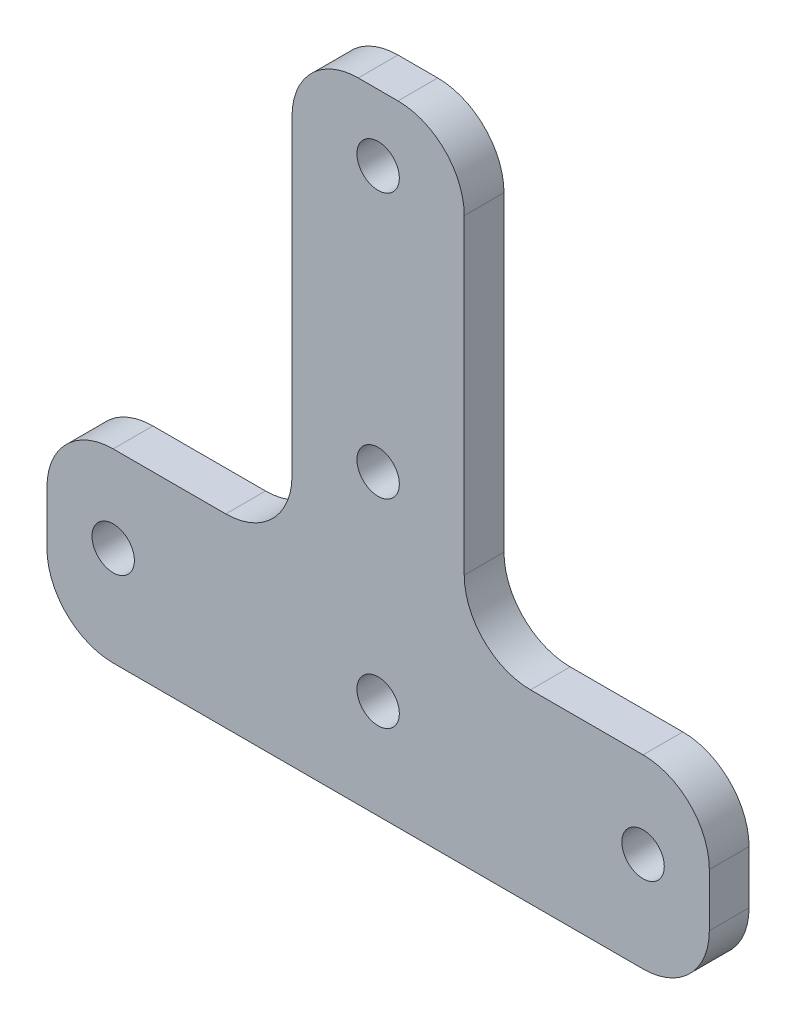
ISO-10303-21;
HEADER;
FILE_DESCRIPTION(('STEP AP214'),'2;1');
FILE_NAME('part.step','',(''),(''),'','','');
FILE_SCHEMA(('AUTOMOTIVE_DESIGN { 1 0 10303 214 1 1 1 1 }'));
ENDSEC;
DATA;
#1=APPLICATION_CONTEXT('core data for automotive mechanical design processes');
#2=APPLICATION_PROTOCOL_DEFINITION('international standard','automotive_design',2000,#1);
#3=PRODUCT_CONTEXT('',#1,'mechanical');
#4=PRODUCT('Part','Part','',(#3));
#5=PRODUCT_RELATED_PRODUCT_CATEGORY('part','',(#4));
#6=PRODUCT_DEFINITION_FORMATION('','',#4);
#7=PRODUCT_DEFINITION_CONTEXT('part definition',#1,'design');
#8=PRODUCT_DEFINITION('design','',#6,#7);
#9=PRODUCT_DEFINITION_SHAPE('','',#8);
#10=(LENGTH_UNIT() NAMED_UNIT(*) SI_UNIT(.MILLI.,.METRE.));
#11=(NAMED_UNIT(*) PLANE_ANGLE_UNIT() SI_UNIT($,.RADIAN.));
#12=(NAMED_UNIT(*) SI_UNIT($,.STERADIAN.) SOLID_ANGLE_UNIT());
#13=UNCERTAINTY_MEASURE_WITH_UNIT(LENGTH_MEASURE(1.E-05),#10,'distance_accuracy_value','');
#14=(GEOMETRIC_REPRESENTATION_CONTEXT(3) GLOBAL_UNCERTAINTY_ASSIGNED_CONTEXT((#13)) GLOBAL_UNIT_ASSIGNED_CONTEXT((#10,
#11,#12)) REPRESENTATION_CONTEXT('',''));
#15=CARTESIAN_POINT('',(0.,0.,0.));
#16=DIRECTION('',(0.,0.,1.));
#17=DIRECTION('',(1.,0.,0.));
#18=AXIS2_PLACEMENT_3D('',#15,#16,#17);
#19=CARTESIAN_POINT('',(0.,0.,3.));
#20=DIRECTION('',(0.,0.,-1.));
#21=DIRECTION('',(-1.,0.,0.));
#22=AXIS2_PLACEMENT_3D('',#19,#20,#21);
#23=PLANE('',#22);
#24=DIRECTION('',(-1.,0.,0.));
#25=VECTOR('',#24,1.);
#26=CARTESIAN_POINT('',(6.5,40.,3.));
#27=LINE('',#26,#25);
#28=CARTESIAN_POINT('',(1.5,40.,3.));
#29=VERTEX_POINT('',#28);
#30=CARTESIAN_POINT('',(-1.5,40.,3.));
#31=VERTEX_POINT('',#30);
#32=EDGE_CURVE('E202',#29,#31,#27,.T.);
#33=ORIENTED_EDGE('',*,*,#32,.T.);
#34=CARTESIAN_POINT('',(-1.5,35.,3.));
#35=DIRECTION('',(0.,0.,-1.));
#36=DIRECTION('',(-1.,0.,0.));
#37=AXIS2_PLACEMENT_3D('',#34,#35,#36);
#38=CIRCLE('',#37,5.);
#39=CARTESIAN_POINT('',(-6.5,35.,3.));
#40=VERTEX_POINT('',#39);
#41=EDGE_CURVE('E261',#31,#40,#38,.F.);
#42=ORIENTED_EDGE('',*,*,#41,.T.);
#43=DIRECTION('',(0.,-1.,0.));
#44=VECTOR('',#43,1.);
#45=CARTESIAN_POINT('',(-6.5,40.,3.));
#46=LINE('',#45,#44);
#47=CARTESIAN_POINT('',(-6.5,11.5,3.));
#48=VERTEX_POINT('',#47);
#49=EDGE_CURVE('E180',#40,#48,#46,.T.);
#50=ORIENTED_EDGE('',*,*,#49,.T.);
#51=CARTESIAN_POINT('',(-11.5,11.5,3.));
#52=DIRECTION('',(0.,0.,-1.));
#53=DIRECTION('',(-1.,0.,0.));
#54=AXIS2_PLACEMENT_3D('',#51,#52,#53);
#55=CIRCLE('',#54,5.);
#56=CARTESIAN_POINT('',(-11.5,6.5,3.));
#57=VERTEX_POINT('',#56);
#58=EDGE_CURVE('E307',#48,#57,#55,.T.);
#59=ORIENTED_EDGE('',*,*,#58,.T.);
#60=DIRECTION('',(-1.,0.,0.));
#61=VECTOR('',#60,1.);
#62=CARTESIAN_POINT('',(-6.5,6.5,3.));
#63=LINE('',#62,#61);
#64=CARTESIAN_POINT('',(-20.,6.49999999999999,3.));
#65=VERTEX_POINT('',#64);
#66=EDGE_CURVE('E341',#57,#65,#63,.T.);
#67=ORIENTED_EDGE('',*,*,#66,.T.);
#68=CARTESIAN_POINT('',(-20.,1.49999999999999,3.));
#69=DIRECTION('',(0.,0.,-1.));
#70=DIRECTION('',(-1.,0.,0.));
#71=AXIS2_PLACEMENT_3D('',#68,#69,#70);
#72=CIRCLE('',#71,5.);
#73=CARTESIAN_POINT('',(-25.,1.5,3.));
#74=VERTEX_POINT('',#73);
#75=EDGE_CURVE('E246',#65,#74,#72,.F.);
#76=ORIENTED_EDGE('',*,*,#75,.T.);
#77=DIRECTION('',(0.,-1.,0.));
#78=VECTOR('',#77,1.);
#79=CARTESIAN_POINT('',(-25.,6.49999999999999,3.));
#80=LINE('',#79,#78);
#81=CARTESIAN_POINT('',(-25.,-2.5,3.));
#82=VERTEX_POINT('',#81);
#83=EDGE_CURVE('E337',#74,#82,#80,.T.);
#84=ORIENTED_EDGE('',*,*,#83,.T.);
#85=CARTESIAN_POINT('',(-20.,-2.5,3.));
#86=DIRECTION('',(0.,0.,-1.));
#87=DIRECTION('',(-1.,0.,0.));
#88=AXIS2_PLACEMENT_3D('',#85,#86,#87);
#89=CIRCLE('',#88,5.);
#90=CARTESIAN_POINT('',(-20.,-7.50000000000001,3.));
#91=VERTEX_POINT('',#90);
#92=EDGE_CURVE('E249',#82,#91,#89,.F.);
#93=ORIENTED_EDGE('',*,*,#92,.T.);
#94=DIRECTION('',(1.,0.,0.));
#95=VECTOR('',#94,1.);
#96=CARTESIAN_POINT('',(-25.,-7.50000000000001,3.));
#97=LINE('',#96,#95);
#98=CARTESIAN_POINT('',(20.,-7.50000000000001,3.));
#99=VERTEX_POINT('',#98);
#100=EDGE_CURVE('E333',#91,#99,#97,.T.);
#101=ORIENTED_EDGE('',*,*,#100,.T.);
#102=CARTESIAN_POINT('',(20.,-2.5,3.));
#103=DIRECTION('',(0.,0.,-1.));
#104=DIRECTION('',(-1.,0.,0.));
#105=AXIS2_PLACEMENT_3D('',#102,#103,#104);
#106=CIRCLE('',#105,5.);
#107=CARTESIAN_POINT('',(25.,-2.5,3.));
#108=VERTEX_POINT('',#107);
#109=EDGE_CURVE('E252',#99,#108,#106,.F.);
#110=ORIENTED_EDGE('',*,*,#109,.T.);
#111=DIRECTION('',(0.,1.,0.));
#112=VECTOR('',#111,1.);
#113=CARTESIAN_POINT('',(25.,-7.50000000000001,3.));
#114=LINE('',#113,#112);
#115=CARTESIAN_POINT('',(25.,1.5,3.));
#116=VERTEX_POINT('',#115);
#117=EDGE_CURVE('E327',#108,#116,#114,.T.);
#118=ORIENTED_EDGE('',*,*,#117,.T.);
#119=CARTESIAN_POINT('',(20.,1.5,3.));
#120=DIRECTION('',(0.,0.,-1.));
#121=DIRECTION('',(-1.,0.,0.));
#122=AXIS2_PLACEMENT_3D('',#119,#120,#121);
#123=CIRCLE('',#122,5.);
#124=CARTESIAN_POINT('',(20.,6.5,3.));
#125=VERTEX_POINT('',#124);
#126=EDGE_CURVE('E255',#116,#125,#123,.F.);
#127=ORIENTED_EDGE('',*,*,#126,.T.);
#128=DIRECTION('',(-1.,0.,0.));
#129=VECTOR('',#128,1.);
#130=CARTESIAN_POINT('',(25.,6.5,3.));
#131=LINE('',#130,#129);
#132=CARTESIAN_POINT('',(11.5,6.5,3.));
#133=VERTEX_POINT('',#132);
#134=EDGE_CURVE('E323',#125,#133,#131,.T.);
#135=ORIENTED_EDGE('',*,*,#134,.T.);
#136=CARTESIAN_POINT('',(11.5,11.5,3.));
#137=DIRECTION('',(0.,0.,-1.));
#138=DIRECTION('',(-1.,0.,0.));
#139=AXIS2_PLACEMENT_3D('',#136,#137,#138);
#140=CIRCLE('',#139,5.);
#141=CARTESIAN_POINT('',(6.5,11.5,3.));
#142=VERTEX_POINT('',#141);
#143=EDGE_CURVE('E11',#133,#142,#140,.T.);
#144=ORIENTED_EDGE('',*,*,#143,.T.);
#145=DIRECTION('',(0.,1.,0.));
#146=VECTOR('',#145,1.);
#147=CARTESIAN_POINT('',(6.5,6.5,3.));
#148=LINE('',#147,#146);
#149=CARTESIAN_POINT('',(6.5,35.,3.));
#150=VERTEX_POINT('',#149);
#151=EDGE_CURVE('E320',#142,#150,#148,.T.);
#152=ORIENTED_EDGE('',*,*,#151,.T.);
#153=CARTESIAN_POINT('',(1.5,35.,3.));
#154=DIRECTION('',(0.,0.,-1.));
#155=DIRECTION('',(-1.,0.,0.));
#156=AXIS2_PLACEMENT_3D('',#153,#154,#155);
#157=CIRCLE('',#156,5.);
#158=EDGE_CURVE('E258',#150,#29,#157,.F.);
#159=ORIENTED_EDGE('',*,*,#158,.T.);
#160=EDGE_LOOP('',(#33,#42,#50,#59,#67,#76,#84,#93,#101,#110,#118,#127,#135,#144,#152,#159));
#161=FACE_BOUND('',#160,.T.);
#162=CARTESIAN_POINT('',(0.,35.,3.));
#163=DIRECTION('',(0.,0.,1.));
#164=DIRECTION('',(1.,0.,0.));
#165=AXIS2_PLACEMENT_3D('',#162,#163,#164);
#166=CIRCLE('',#165,1.6);
#167=CARTESIAN_POINT('',(1.6,35.,3.));
#168=VERTEX_POINT('',#167);
#169=EDGE_CURVE('E191',#168,#168,#166,.T.);
#170=ORIENTED_EDGE('',*,*,#169,.F.);
#171=EDGE_LOOP('',(#170));
#172=FACE_BOUND('',#171,.T.);
#173=CARTESIAN_POINT('',(0.,15.,3.));
#174=DIRECTION('',(0.,0.,1.));
#175=DIRECTION('',(1.,0.,0.));
#176=AXIS2_PLACEMENT_3D('',#173,#174,#175);
#177=CIRCLE('',#176,1.6);
#178=CARTESIAN_POINT('',(1.6,15.,3.));
#179=VERTEX_POINT('',#178);
#180=EDGE_CURVE('E349',#179,#179,#177,.T.);
#181=ORIENTED_EDGE('',*,*,#180,.F.);
#182=EDGE_LOOP('',(#181));
#183=FACE_BOUND('',#182,.T.);
#184=CARTESIAN_POINT('',(0.,0.,3.));
#185=DIRECTION('',(0.,0.,1.));
#186=DIRECTION('',(1.,0.,0.));
#187=AXIS2_PLACEMENT_3D('',#184,#185,#186);
#188=CIRCLE('',#187,1.6);
#189=CARTESIAN_POINT('',(1.6,0.,3.));
#190=VERTEX_POINT('',#189);
#191=EDGE_CURVE('E355',#190,#190,#188,.T.);
#192=ORIENTED_EDGE('',*,*,#191,.F.);
#193=EDGE_LOOP('',(#192));
#194=FACE_BOUND('',#193,.T.);
#195=CARTESIAN_POINT('',(20.,0.,3.));
#196=DIRECTION('',(0.,0.,1.));
#197=DIRECTION('',(1.,0.,0.));
#198=AXIS2_PLACEMENT_3D('',#195,#196,#197);
#199=CIRCLE('',#198,1.6);
#200=CARTESIAN_POINT('',(21.6,0.,3.));
#201=VERTEX_POINT('',#200);
#202=EDGE_CURVE('E363',#201,#201,#199,.T.);
#203=ORIENTED_EDGE('',*,*,#202,.F.);
#204=EDGE_LOOP('',(#203));
#205=FACE_BOUND('',#204,.T.);
#206=CARTESIAN_POINT('',(-20.,0.,3.));
#207=DIRECTION('',(0.,0.,1.));
#208=DIRECTION('',(1.,0.,0.));
#209=AXIS2_PLACEMENT_3D('',#206,#207,#208);
#210=CIRCLE('',#209,1.6);
#211=CARTESIAN_POINT('',(-18.4,0.,3.));
#212=VERTEX_POINT('',#211);
#213=EDGE_CURVE('E371',#212,#212,#210,.T.);
#214=ORIENTED_EDGE('',*,*,#213,.F.);
#215=EDGE_LOOP('',(#214));
#216=FACE_BOUND('',#215,.T.);
#217=ADVANCED_FACE('F45',(#161,#172,#183,#194,#205,#216),#23,.F.);
#218=CARTESIAN_POINT('',(0.,0.,0.));
#219=DIRECTION('',(0.,0.,-1.));
#220=DIRECTION('',(-1.,0.,0.));
#221=AXIS2_PLACEMENT_3D('',#218,#219,#220);
#222=PLANE('',#221);
#223=CARTESIAN_POINT('',(20.,0.,0.));
#224=DIRECTION('',(0.,0.,1.));
#225=DIRECTION('',(1.,0.,0.));
#226=AXIS2_PLACEMENT_3D('',#223,#224,#225);
#227=CIRCLE('',#226,1.6);
#228=CARTESIAN_POINT('',(21.6,0.,0.));
#229=VERTEX_POINT('',#228);
#230=EDGE_CURVE('E367',#229,#229,#227,.T.);
#231=ORIENTED_EDGE('',*,*,#230,.T.);
#232=EDGE_LOOP('',(#231));
#233=FACE_BOUND('',#232,.T.);
#234=CARTESIAN_POINT('',(0.,15.,0.));
#235=DIRECTION('',(0.,0.,1.));
#236=DIRECTION('',(1.,0.,0.));
#237=AXIS2_PLACEMENT_3D('',#234,#235,#236);
#238=CIRCLE('',#237,1.6);
#239=CARTESIAN_POINT('',(1.6,15.,0.));
#240=VERTEX_POINT('',#239);
#241=EDGE_CURVE('E351',#240,#240,#238,.T.);
#242=ORIENTED_EDGE('',*,*,#241,.T.);
#243=EDGE_LOOP('',(#242));
#244=FACE_BOUND('',#243,.T.);
#245=DIRECTION('',(0.,-1.,0.));
#246=VECTOR('',#245,1.);
#247=CARTESIAN_POINT('',(-6.5,40.,0.));
#248=LINE('',#247,#246);
#249=CARTESIAN_POINT('',(-6.5,35.,0.));
#250=VERTEX_POINT('',#249);
#251=CARTESIAN_POINT('',(-6.5,11.5,0.));
#252=VERTEX_POINT('',#251);
#253=EDGE_CURVE('E177',#250,#252,#248,.T.);
#254=ORIENTED_EDGE('',*,*,#253,.F.);
#255=CARTESIAN_POINT('',(-1.5,35.,0.));
#256=DIRECTION('',(0.,0.,-1.));
#257=DIRECTION('',(-1.,0.,0.));
#258=AXIS2_PLACEMENT_3D('',#255,#256,#257);
#259=CIRCLE('',#258,5.);
#260=CARTESIAN_POINT('',(-1.5,40.,0.));
#261=VERTEX_POINT('',#260);
#262=EDGE_CURVE('E159',#250,#261,#259,.T.);
#263=ORIENTED_EDGE('',*,*,#262,.T.);
#264=DIRECTION('',(-1.,0.,0.));
#265=VECTOR('',#264,1.);
#266=CARTESIAN_POINT('',(6.5,40.,0.));
#267=LINE('',#266,#265);
#268=CARTESIAN_POINT('',(1.5,40.,0.));
#269=VERTEX_POINT('',#268);
#270=EDGE_CURVE('E223',#269,#261,#267,.T.);
#271=ORIENTED_EDGE('',*,*,#270,.F.);
#272=CARTESIAN_POINT('',(1.5,35.,0.));
#273=DIRECTION('',(0.,0.,-1.));
#274=DIRECTION('',(-1.,0.,0.));
#275=AXIS2_PLACEMENT_3D('',#272,#273,#274);
#276=CIRCLE('',#275,5.);
#277=CARTESIAN_POINT('',(6.5,35.,0.));
#278=VERTEX_POINT('',#277);
#279=EDGE_CURVE('E171',#269,#278,#276,.T.);
#280=ORIENTED_EDGE('',*,*,#279,.T.);
#281=DIRECTION('',(0.,1.,0.));
#282=VECTOR('',#281,1.);
#283=CARTESIAN_POINT('',(6.5,6.5,0.));
#284=LINE('',#283,#282);
#285=CARTESIAN_POINT('',(6.5,11.5,0.));
#286=VERTEX_POINT('',#285);
#287=EDGE_CURVE('E220',#286,#278,#284,.T.);
#288=ORIENTED_EDGE('',*,*,#287,.F.);
#289=CARTESIAN_POINT('',(11.5,11.5,0.));
#290=DIRECTION('',(0.,0.,-1.));
#291=DIRECTION('',(-1.,0.,0.));
#292=AXIS2_PLACEMENT_3D('',#289,#290,#291);
#293=CIRCLE('',#292,5.);
#294=CARTESIAN_POINT('',(11.5,6.5,0.));
#295=VERTEX_POINT('',#294);
#296=EDGE_CURVE('E54',#286,#295,#293,.F.);
#297=ORIENTED_EDGE('',*,*,#296,.T.);
#298=DIRECTION('',(-1.,0.,0.));
#299=VECTOR('',#298,1.);
#300=CARTESIAN_POINT('',(25.,6.5,0.));
#301=LINE('',#300,#299);
#302=CARTESIAN_POINT('',(20.,6.5,0.));
#303=VERTEX_POINT('',#302);
#304=EDGE_CURVE('E216',#303,#295,#301,.T.);
#305=ORIENTED_EDGE('',*,*,#304,.F.);
#306=CARTESIAN_POINT('',(20.,1.5,0.));
#307=DIRECTION('',(0.,0.,-1.));
#308=DIRECTION('',(-1.,0.,0.));
#309=AXIS2_PLACEMENT_3D('',#306,#307,#308);
#310=CIRCLE('',#309,5.);
#311=CARTESIAN_POINT('',(25.,1.5,0.));
#312=VERTEX_POINT('',#311);
#313=EDGE_CURVE('E236',#303,#312,#310,.T.);
#314=ORIENTED_EDGE('',*,*,#313,.T.);
#315=DIRECTION('',(0.,1.,0.));
#316=VECTOR('',#315,1.);
#317=CARTESIAN_POINT('',(25.,-7.50000000000001,0.));
#318=LINE('',#317,#316);
#319=CARTESIAN_POINT('',(25.,-2.5,0.));
#320=VERTEX_POINT('',#319);
#321=EDGE_CURVE('E212',#320,#312,#318,.T.);
#322=ORIENTED_EDGE('',*,*,#321,.F.);
#323=CARTESIAN_POINT('',(20.,-2.5,0.));
#324=DIRECTION('',(0.,0.,-1.));
#325=DIRECTION('',(-1.,0.,0.));
#326=AXIS2_PLACEMENT_3D('',#323,#324,#325);
#327=CIRCLE('',#326,5.);
#328=CARTESIAN_POINT('',(20.,-7.50000000000001,0.));
#329=VERTEX_POINT('',#328);
#330=EDGE_CURVE('E233',#320,#329,#327,.T.);
#331=ORIENTED_EDGE('',*,*,#330,.T.);
#332=DIRECTION('',(1.,0.,0.));
#333=VECTOR('',#332,1.);
#334=CARTESIAN_POINT('',(-25.,-7.50000000000001,0.));
#335=LINE('',#334,#333);
#336=CARTESIAN_POINT('',(-20.,-7.50000000000001,0.));
#337=VERTEX_POINT('',#336);
#338=EDGE_CURVE('E208',#337,#329,#335,.T.);
#339=ORIENTED_EDGE('',*,*,#338,.F.);
#340=CARTESIAN_POINT('',(-20.,-2.5,0.));
#341=DIRECTION('',(0.,0.,-1.));
#342=DIRECTION('',(-1.,0.,0.));
#343=AXIS2_PLACEMENT_3D('',#340,#341,#342);
#344=CIRCLE('',#343,5.);
#345=CARTESIAN_POINT('',(-25.,-2.5,0.));
#346=VERTEX_POINT('',#345);
#347=EDGE_CURVE('E230',#337,#346,#344,.T.);
#348=ORIENTED_EDGE('',*,*,#347,.T.);
#349=DIRECTION('',(0.,-1.,0.));
#350=VECTOR('',#349,1.);
#351=CARTESIAN_POINT('',(-25.,6.49999999999999,0.));
#352=LINE('',#351,#350);
#353=CARTESIAN_POINT('',(-25.,1.5,0.));
#354=VERTEX_POINT('',#353);
#355=EDGE_CURVE('E196',#354,#346,#352,.T.);
#356=ORIENTED_EDGE('',*,*,#355,.F.);
#357=CARTESIAN_POINT('',(-20.,1.49999999999999,0.));
#358=DIRECTION('',(0.,0.,-1.));
#359=DIRECTION('',(-1.,0.,0.));
#360=AXIS2_PLACEMENT_3D('',#357,#358,#359);
#361=CIRCLE('',#360,5.);
#362=CARTESIAN_POINT('',(-20.,6.49999999999999,0.));
#363=VERTEX_POINT('',#362);
#364=EDGE_CURVE('E182',#354,#363,#361,.T.);
#365=ORIENTED_EDGE('',*,*,#364,.T.);
#366=DIRECTION('',(-1.,0.,0.));
#367=VECTOR('',#366,1.);
#368=CARTESIAN_POINT('',(-6.5,6.5,0.));
#369=LINE('',#368,#367);
#370=CARTESIAN_POINT('',(-11.5,6.5,0.));
#371=VERTEX_POINT('',#370);
#372=EDGE_CURVE('E190',#371,#363,#369,.T.);
#373=ORIENTED_EDGE('',*,*,#372,.F.);
#374=CARTESIAN_POINT('',(-11.5,11.5,0.));
#375=DIRECTION('',(0.,0.,-1.));
#376=DIRECTION('',(-1.,0.,0.));
#377=AXIS2_PLACEMENT_3D('',#374,#375,#376);
#378=CIRCLE('',#377,5.);
#379=EDGE_CURVE('E188',#371,#252,#378,.F.);
#380=ORIENTED_EDGE('',*,*,#379,.T.);
#381=EDGE_LOOP('',(#254,#263,#271,#280,#288,#297,#305,#314,#322,#331,#339,#348,#356,#365,#373,#380));
#382=FACE_BOUND('',#381,.T.);
#383=CARTESIAN_POINT('',(0.,35.,0.));
#384=DIRECTION('',(0.,0.,1.));
#385=DIRECTION('',(1.,0.,0.));
#386=AXIS2_PLACEMENT_3D('',#383,#384,#385);
#387=CIRCLE('',#386,1.6);
#388=CARTESIAN_POINT('',(1.6,35.,0.));
#389=VERTEX_POINT('',#388);
#390=EDGE_CURVE('E199',#389,#389,#387,.T.);
#391=ORIENTED_EDGE('',*,*,#390,.T.);
#392=EDGE_LOOP('',(#391));
#393=FACE_BOUND('',#392,.T.);
#394=CARTESIAN_POINT('',(0.,0.,0.));
#395=DIRECTION('',(0.,0.,1.));
#396=DIRECTION('',(1.,0.,0.));
#397=AXIS2_PLACEMENT_3D('',#394,#395,#396);
#398=CIRCLE('',#397,1.6);
#399=CARTESIAN_POINT('',(1.6,0.,0.));
#400=VERTEX_POINT('',#399);
#401=EDGE_CURVE('E359',#400,#400,#398,.T.);
#402=ORIENTED_EDGE('',*,*,#401,.T.);
#403=EDGE_LOOP('',(#402));
#404=FACE_BOUND('',#403,.T.);
#405=CARTESIAN_POINT('',(-20.,0.,0.));
#406=DIRECTION('',(0.,0.,1.));
#407=DIRECTION('',(1.,0.,0.));
#408=AXIS2_PLACEMENT_3D('',#405,#406,#407);
#409=CIRCLE('',#408,1.6);
#410=CARTESIAN_POINT('',(-18.4,0.,0.));
#411=VERTEX_POINT('',#410);
#412=EDGE_CURVE('E375',#411,#411,#409,.T.);
#413=ORIENTED_EDGE('',*,*,#412,.T.);
#414=EDGE_LOOP('',(#413));
#415=FACE_BOUND('',#414,.T.);
#416=ADVANCED_FACE('F185',(#233,#244,#382,#393,#404,#415),#222,.T.);
#417=CARTESIAN_POINT('',(-6.5,40.,3.));
#418=DIRECTION('',(1.,0.,0.));
#419=DIRECTION('',(0.,1.,0.));
#420=AXIS2_PLACEMENT_3D('',#417,#418,#419);
#421=PLANE('',#420);
#422=ORIENTED_EDGE('',*,*,#49,.F.);
#423=DIRECTION('',(0.,0.,-1.));
#424=VECTOR('',#423,1.);
#425=CARTESIAN_POINT('',(-6.5,35.,3.));
#426=LINE('',#425,#424);
#427=EDGE_CURVE('E163',#40,#250,#426,.T.);
#428=ORIENTED_EDGE('',*,*,#427,.T.);
#429=ORIENTED_EDGE('',*,*,#253,.T.);
#430=DIRECTION('',(0.,0.,-1.));
#431=VECTOR('',#430,1.);
#432=CARTESIAN_POINT('',(-6.5,11.5,3.));
#433=LINE('',#432,#431);
#434=EDGE_CURVE('E183',#252,#48,#433,.F.);
#435=ORIENTED_EDGE('',*,*,#434,.T.);
#436=EDGE_LOOP('',(#422,#428,#429,#435));
#437=FACE_BOUND('',#436,.T.);
#438=ADVANCED_FACE('F176',(#437),#421,.F.);
#439=CARTESIAN_POINT('',(-6.5,6.5,3.));
#440=DIRECTION('',(0.,-1.,0.));
#441=DIRECTION('',(1.,0.,0.));
#442=AXIS2_PLACEMENT_3D('',#439,#440,#441);
#443=PLANE('',#442);
#444=ORIENTED_EDGE('',*,*,#372,.T.);
#445=DIRECTION('',(0.,0.,-1.));
#446=VECTOR('',#445,1.);
#447=CARTESIAN_POINT('',(-20.,6.49999999999999,3.));
#448=LINE('',#447,#446);
#449=EDGE_CURVE('E302',#363,#65,#448,.F.);
#450=ORIENTED_EDGE('',*,*,#449,.T.);
#451=ORIENTED_EDGE('',*,*,#66,.F.);
#452=DIRECTION('',(0.,0.,-1.));
#453=VECTOR('',#452,1.);
#454=CARTESIAN_POINT('',(-11.5,6.5,0.));
#455=LINE('',#454,#453);
#456=EDGE_CURVE('E298',#57,#371,#455,.T.);
#457=ORIENTED_EDGE('',*,*,#456,.T.);
#458=EDGE_LOOP('',(#444,#450,#451,#457));
#459=FACE_BOUND('',#458,.T.);
#460=ADVANCED_FACE('F418',(#459),#443,.F.);
#461=CARTESIAN_POINT('',(-25.,6.49999999999999,3.));
#462=DIRECTION('',(1.,0.,0.));
#463=DIRECTION('',(0.,0.,-1.));
#464=AXIS2_PLACEMENT_3D('',#461,#462,#463);
#465=PLANE('',#464);
#466=ORIENTED_EDGE('',*,*,#355,.T.);
#467=DIRECTION('',(0.,0.,-1.));
#468=VECTOR('',#467,1.);
#469=CARTESIAN_POINT('',(-25.,-2.5,3.));
#470=LINE('',#469,#468);
#471=EDGE_CURVE('E295',#346,#82,#470,.F.);
#472=ORIENTED_EDGE('',*,*,#471,.T.);
#473=ORIENTED_EDGE('',*,*,#83,.F.);
#474=DIRECTION('',(0.,0.,-1.));
#475=VECTOR('',#474,1.);
#476=CARTESIAN_POINT('',(-25.,1.49999999999999,3.));
#477=LINE('',#476,#475);
#478=EDGE_CURVE('E291',#74,#354,#477,.T.);
#479=ORIENTED_EDGE('',*,*,#478,.T.);
#480=EDGE_LOOP('',(#466,#472,#473,#479));
#481=FACE_BOUND('',#480,.T.);
#482=ADVANCED_FACE('F414',(#481),#465,.F.);
#483=CARTESIAN_POINT('',(-25.,-7.50000000000001,3.));
#484=DIRECTION('',(0.,1.,0.));
#485=DIRECTION('',(0.,0.,1.));
#486=AXIS2_PLACEMENT_3D('',#483,#484,#485);
#487=PLANE('',#486);
#488=ORIENTED_EDGE('',*,*,#338,.T.);
#489=DIRECTION('',(0.,0.,-1.));
#490=VECTOR('',#489,1.);
#491=CARTESIAN_POINT('',(20.,-7.50000000000001,3.));
#492=LINE('',#491,#490);
#493=EDGE_CURVE('E288',#329,#99,#492,.F.);
#494=ORIENTED_EDGE('',*,*,#493,.T.);
#495=ORIENTED_EDGE('',*,*,#100,.F.);
#496=DIRECTION('',(0.,0.,-1.));
#497=VECTOR('',#496,1.);
#498=CARTESIAN_POINT('',(-20.,-7.50000000000001,3.));
#499=LINE('',#498,#497);
#500=EDGE_CURVE('E284',#91,#337,#499,.T.);
#501=ORIENTED_EDGE('',*,*,#500,.T.);
#502=EDGE_LOOP('',(#488,#494,#495,#501));
#503=FACE_BOUND('',#502,.T.);
#504=ADVANCED_FACE('F410',(#503),#487,.F.);
#505=CARTESIAN_POINT('',(25.,-7.50000000000001,3.));
#506=DIRECTION('',(-1.,0.,0.));
#507=DIRECTION('',(0.,0.,1.));
#508=AXIS2_PLACEMENT_3D('',#505,#506,#507);
#509=PLANE('',#508);
#510=ORIENTED_EDGE('',*,*,#321,.T.);
#511=DIRECTION('',(0.,0.,-1.));
#512=VECTOR('',#511,1.);
#513=CARTESIAN_POINT('',(25.,1.5,3.));
#514=LINE('',#513,#512);
#515=EDGE_CURVE('E281',#312,#116,#514,.F.);
#516=ORIENTED_EDGE('',*,*,#515,.T.);
#517=ORIENTED_EDGE('',*,*,#117,.F.);
#518=DIRECTION('',(0.,0.,-1.));
#519=VECTOR('',#518,1.);
#520=CARTESIAN_POINT('',(25.,-2.5,3.));
#521=LINE('',#520,#519);
#522=EDGE_CURVE('E277',#108,#320,#521,.T.);
#523=ORIENTED_EDGE('',*,*,#522,.T.);
#524=EDGE_LOOP('',(#510,#516,#517,#523));
#525=FACE_BOUND('',#524,.T.);
#526=ADVANCED_FACE('F407',(#525),#509,.F.);
#527=CARTESIAN_POINT('',(25.,6.5,3.));
#528=DIRECTION('',(0.,-1.,0.));
#529=DIRECTION('',(1.,0.,0.));
#530=AXIS2_PLACEMENT_3D('',#527,#528,#529);
#531=PLANE('',#530);
#532=ORIENTED_EDGE('',*,*,#134,.F.);
#533=DIRECTION('',(0.,0.,-1.));
#534=VECTOR('',#533,1.);
#535=CARTESIAN_POINT('',(20.,6.5,3.));
#536=LINE('',#535,#534);
#537=EDGE_CURVE('E273',#125,#303,#536,.T.);
#538=ORIENTED_EDGE('',*,*,#537,.T.);
#539=ORIENTED_EDGE('',*,*,#304,.T.);
#540=DIRECTION('',(0.,0.,-1.));
#541=VECTOR('',#540,1.);
#542=CARTESIAN_POINT('',(11.5,6.5,3.));
#543=LINE('',#542,#541);
#544=EDGE_CURVE('E270',#295,#133,#543,.F.);
#545=ORIENTED_EDGE('',*,*,#544,.T.);
#546=EDGE_LOOP('',(#532,#538,#539,#545));
#547=FACE_BOUND('',#546,.T.);
#548=ADVANCED_FACE('F317',(#547),#531,.F.);
#549=CARTESIAN_POINT('',(6.5,6.5,3.));
#550=DIRECTION('',(-1.,0.,0.));
#551=DIRECTION('',(0.,-1.,0.));
#552=AXIS2_PLACEMENT_3D('',#549,#550,#551);
#553=PLANE('',#552);
#554=ORIENTED_EDGE('',*,*,#287,.T.);
#555=DIRECTION('',(0.,0.,-1.));
#556=VECTOR('',#555,1.);
#557=CARTESIAN_POINT('',(6.5,35.,3.));
#558=LINE('',#557,#556);
#559=EDGE_CURVE('E61',#278,#150,#558,.F.);
#560=ORIENTED_EDGE('',*,*,#559,.T.);
#561=ORIENTED_EDGE('',*,*,#151,.F.);
#562=DIRECTION('',(0.,0.,-1.));
#563=VECTOR('',#562,1.);
#564=CARTESIAN_POINT('',(6.5,11.5,0.));
#565=LINE('',#564,#563);
#566=EDGE_CURVE('E264',#142,#286,#565,.T.);
#567=ORIENTED_EDGE('',*,*,#566,.T.);
#568=EDGE_LOOP('',(#554,#560,#561,#567));
#569=FACE_BOUND('',#568,.T.);
#570=ADVANCED_FACE('F319',(#569),#553,.F.);
#571=CARTESIAN_POINT('',(6.5,40.,3.));
#572=DIRECTION('',(0.,-1.,0.));
#573=DIRECTION('',(0.,0.,-1.));
#574=AXIS2_PLACEMENT_3D('',#571,#572,#573);
#575=PLANE('',#574);
#576=ORIENTED_EDGE('',*,*,#270,.T.);
#577=DIRECTION('',(0.,0.,-1.));
#578=VECTOR('',#577,1.);
#579=CARTESIAN_POINT('',(-1.5,40.,3.));
#580=LINE('',#579,#578);
#581=EDGE_CURVE('E164',#261,#31,#580,.F.);
#582=ORIENTED_EDGE('',*,*,#581,.T.);
#583=ORIENTED_EDGE('',*,*,#32,.F.);
#584=DIRECTION('',(0.,0.,-1.));
#585=VECTOR('',#584,1.);
#586=CARTESIAN_POINT('',(1.5,40.,3.));
#587=LINE('',#586,#585);
#588=EDGE_CURVE('E170',#29,#269,#587,.T.);
#589=ORIENTED_EDGE('',*,*,#588,.T.);
#590=EDGE_LOOP('',(#576,#582,#583,#589));
#591=FACE_BOUND('',#590,.T.);
#592=ADVANCED_FACE('F399',(#591),#575,.F.);
#593=CARTESIAN_POINT('',(0.,35.,3.));
#594=DIRECTION('',(0.,0.,-1.));
#595=DIRECTION('',(-1.,0.,0.));
#596=AXIS2_PLACEMENT_3D('',#593,#594,#595);
#597=CYLINDRICAL_SURFACE('',#596,1.6);
#598=ORIENTED_EDGE('',*,*,#169,.T.);
#599=EDGE_LOOP('',(#598));
#600=FACE_BOUND('',#599,.T.);
#601=ORIENTED_EDGE('',*,*,#390,.F.);
#602=EDGE_LOOP('',(#601));
#603=FACE_BOUND('',#602,.T.);
#604=ADVANCED_FACE('F396',(#600,#603),#597,.F.);
#605=CARTESIAN_POINT('',(0.,15.,3.));
#606=DIRECTION('',(0.,0.,-1.));
#607=DIRECTION('',(-1.,0.,0.));
#608=AXIS2_PLACEMENT_3D('',#605,#606,#607);
#609=CYLINDRICAL_SURFACE('',#608,1.6);
#610=ORIENTED_EDGE('',*,*,#180,.T.);
#611=EDGE_LOOP('',(#610));
#612=FACE_BOUND('',#611,.T.);
#613=ORIENTED_EDGE('',*,*,#241,.F.);
#614=EDGE_LOOP('',(#613));
#615=FACE_BOUND('',#614,.T.);
#616=ADVANCED_FACE('F544',(#612,#615),#609,.F.);
#617=CARTESIAN_POINT('',(0.,0.,3.));
#618=DIRECTION('',(0.,0.,-1.));
#619=DIRECTION('',(-1.,0.,0.));
#620=AXIS2_PLACEMENT_3D('',#617,#618,#619);
#621=CYLINDRICAL_SURFACE('',#620,1.6);
#622=ORIENTED_EDGE('',*,*,#191,.T.);
#623=EDGE_LOOP('',(#622));
#624=FACE_BOUND('',#623,.T.);
#625=ORIENTED_EDGE('',*,*,#401,.F.);
#626=EDGE_LOOP('',(#625));
#627=FACE_BOUND('',#626,.T.);
#628=ADVANCED_FACE('F534',(#624,#627),#621,.F.);
#629=CARTESIAN_POINT('',(20.,0.,3.));
#630=DIRECTION('',(0.,0.,-1.));
#631=DIRECTION('',(-1.,0.,0.));
#632=AXIS2_PLACEMENT_3D('',#629,#630,#631);
#633=CYLINDRICAL_SURFACE('',#632,1.6);
#634=ORIENTED_EDGE('',*,*,#202,.T.);
#635=EDGE_LOOP('',(#634));
#636=FACE_BOUND('',#635,.T.);
#637=ORIENTED_EDGE('',*,*,#230,.F.);
#638=EDGE_LOOP('',(#637));
#639=FACE_BOUND('',#638,.T.);
#640=ADVANCED_FACE('F525',(#636,#639),#633,.F.);
#641=CARTESIAN_POINT('',(-20.,0.,3.));
#642=DIRECTION('',(0.,0.,-1.));
#643=DIRECTION('',(-1.,0.,0.));
#644=AXIS2_PLACEMENT_3D('',#641,#642,#643);
#645=CYLINDRICAL_SURFACE('',#644,1.6);
#646=ORIENTED_EDGE('',*,*,#213,.T.);
#647=EDGE_LOOP('',(#646));
#648=FACE_BOUND('',#647,.T.);
#649=ORIENTED_EDGE('',*,*,#412,.F.);
#650=EDGE_LOOP('',(#649));
#651=FACE_BOUND('',#650,.T.);
#652=ADVANCED_FACE('F383',(#648,#651),#645,.F.);
#653=CARTESIAN_POINT('',(-1.5,35.,3.));
#654=DIRECTION('',(0.,0.,-1.));
#655=DIRECTION('',(-1.,0.,0.));
#656=AXIS2_PLACEMENT_3D('',#653,#654,#655);
#657=CYLINDRICAL_SURFACE('',#656,5.);
#658=ORIENTED_EDGE('',*,*,#41,.F.);
#659=ORIENTED_EDGE('',*,*,#581,.F.);
#660=ORIENTED_EDGE('',*,*,#262,.F.);
#661=ORIENTED_EDGE('',*,*,#427,.F.);
#662=EDGE_LOOP('',(#658,#659,#660,#661));
#663=FACE_BOUND('',#662,.T.);
#664=ADVANCED_FACE('F162',(#663),#657,.T.);
#665=CARTESIAN_POINT('',(1.5,35.,3.));
#666=DIRECTION('',(0.,0.,-1.));
#667=DIRECTION('',(-1.,0.,0.));
#668=AXIS2_PLACEMENT_3D('',#665,#666,#667);
#669=CYLINDRICAL_SURFACE('',#668,5.);
#670=ORIENTED_EDGE('',*,*,#158,.F.);
#671=ORIENTED_EDGE('',*,*,#559,.F.);
#672=ORIENTED_EDGE('',*,*,#279,.F.);
#673=ORIENTED_EDGE('',*,*,#588,.F.);
#674=EDGE_LOOP('',(#670,#671,#672,#673));
#675=FACE_BOUND('',#674,.T.);
#676=ADVANCED_FACE('F427',(#675),#669,.T.);
#677=CARTESIAN_POINT('',(20.,1.5,3.));
#678=DIRECTION('',(0.,0.,-1.));
#679=DIRECTION('',(-1.,0.,0.));
#680=AXIS2_PLACEMENT_3D('',#677,#678,#679);
#681=CYLINDRICAL_SURFACE('',#680,5.);
#682=ORIENTED_EDGE('',*,*,#126,.F.);
#683=ORIENTED_EDGE('',*,*,#515,.F.);
#684=ORIENTED_EDGE('',*,*,#313,.F.);
#685=ORIENTED_EDGE('',*,*,#537,.F.);
#686=EDGE_LOOP('',(#682,#683,#684,#685));
#687=FACE_BOUND('',#686,.T.);
#688=ADVANCED_FACE('F430',(#687),#681,.T.);
#689=CARTESIAN_POINT('',(20.,-2.5,3.));
#690=DIRECTION('',(0.,0.,-1.));
#691=DIRECTION('',(-1.,0.,0.));
#692=AXIS2_PLACEMENT_3D('',#689,#690,#691);
#693=CYLINDRICAL_SURFACE('',#692,5.);
#694=ORIENTED_EDGE('',*,*,#109,.F.);
#695=ORIENTED_EDGE('',*,*,#493,.F.);
#696=ORIENTED_EDGE('',*,*,#330,.F.);
#697=ORIENTED_EDGE('',*,*,#522,.F.);
#698=EDGE_LOOP('',(#694,#695,#696,#697));
#699=FACE_BOUND('',#698,.T.);
#700=ADVANCED_FACE('F434',(#699),#693,.T.);
#701=CARTESIAN_POINT('',(-20.,-2.5,3.));
#702=DIRECTION('',(0.,0.,-1.));
#703=DIRECTION('',(-1.,0.,0.));
#704=AXIS2_PLACEMENT_3D('',#701,#702,#703);
#705=CYLINDRICAL_SURFACE('',#704,5.);
#706=ORIENTED_EDGE('',*,*,#92,.F.);
#707=ORIENTED_EDGE('',*,*,#471,.F.);
#708=ORIENTED_EDGE('',*,*,#347,.F.);
#709=ORIENTED_EDGE('',*,*,#500,.F.);
#710=EDGE_LOOP('',(#706,#707,#708,#709));
#711=FACE_BOUND('',#710,.T.);
#712=ADVANCED_FACE('F438',(#711),#705,.T.);
#713=CARTESIAN_POINT('',(-20.,1.49999999999999,3.));
#714=DIRECTION('',(0.,0.,-1.));
#715=DIRECTION('',(-1.,0.,0.));
#716=AXIS2_PLACEMENT_3D('',#713,#714,#715);
#717=CYLINDRICAL_SURFACE('',#716,5.);
#718=ORIENTED_EDGE('',*,*,#75,.F.);
#719=ORIENTED_EDGE('',*,*,#449,.F.);
#720=ORIENTED_EDGE('',*,*,#364,.F.);
#721=ORIENTED_EDGE('',*,*,#478,.F.);
#722=EDGE_LOOP('',(#718,#719,#720,#721));
#723=FACE_BOUND('',#722,.T.);
#724=ADVANCED_FACE('F442',(#723),#717,.T.);
#725=CARTESIAN_POINT('',(-11.5,11.5,3.));
#726=DIRECTION('',(0.,0.,1.));
#727=DIRECTION('',(1.,0.,0.));
#728=AXIS2_PLACEMENT_3D('',#725,#726,#727);
#729=CYLINDRICAL_SURFACE('',#728,5.);
#730=ORIENTED_EDGE('',*,*,#58,.F.);
#731=ORIENTED_EDGE('',*,*,#434,.F.);
#732=ORIENTED_EDGE('',*,*,#379,.F.);
#733=ORIENTED_EDGE('',*,*,#456,.F.);
#734=EDGE_LOOP('',(#730,#731,#732,#733));
#735=FACE_BOUND('',#734,.T.);
#736=ADVANCED_FACE('F445',(#735),#729,.F.);
#737=CARTESIAN_POINT('',(11.5,11.5,3.));
#738=DIRECTION('',(0.,0.,1.));
#739=DIRECTION('',(1.,0.,0.));
#740=AXIS2_PLACEMENT_3D('',#737,#738,#739);
#741=CYLINDRICAL_SURFACE('',#740,5.);
#742=ORIENTED_EDGE('',*,*,#143,.F.);
#743=ORIENTED_EDGE('',*,*,#544,.F.);
#744=ORIENTED_EDGE('',*,*,#296,.F.);
#745=ORIENTED_EDGE('',*,*,#566,.F.);
#746=EDGE_LOOP('',(#742,#743,#744,#745));
#747=FACE_BOUND('',#746,.T.);
#748=ADVANCED_FACE('F47',(#747),#741,.F.);
#749=CLOSED_SHELL('',(#217,#416,#438,#460,#482,#504,#526,#548,#570,#592,#604,#616,#628,#640,
#652,#664,#676,#688,#700,#712,#724,#736,#748));
#750=MANIFOLD_SOLID_BREP('B2',#749);
#751=ADVANCED_BREP_SHAPE_REPRESENTATION('',(#18,#750),#14);
#752=SHAPE_DEFINITION_REPRESENTATION(#9,#751);
ENDSEC;
END-ISO-10303-21;
